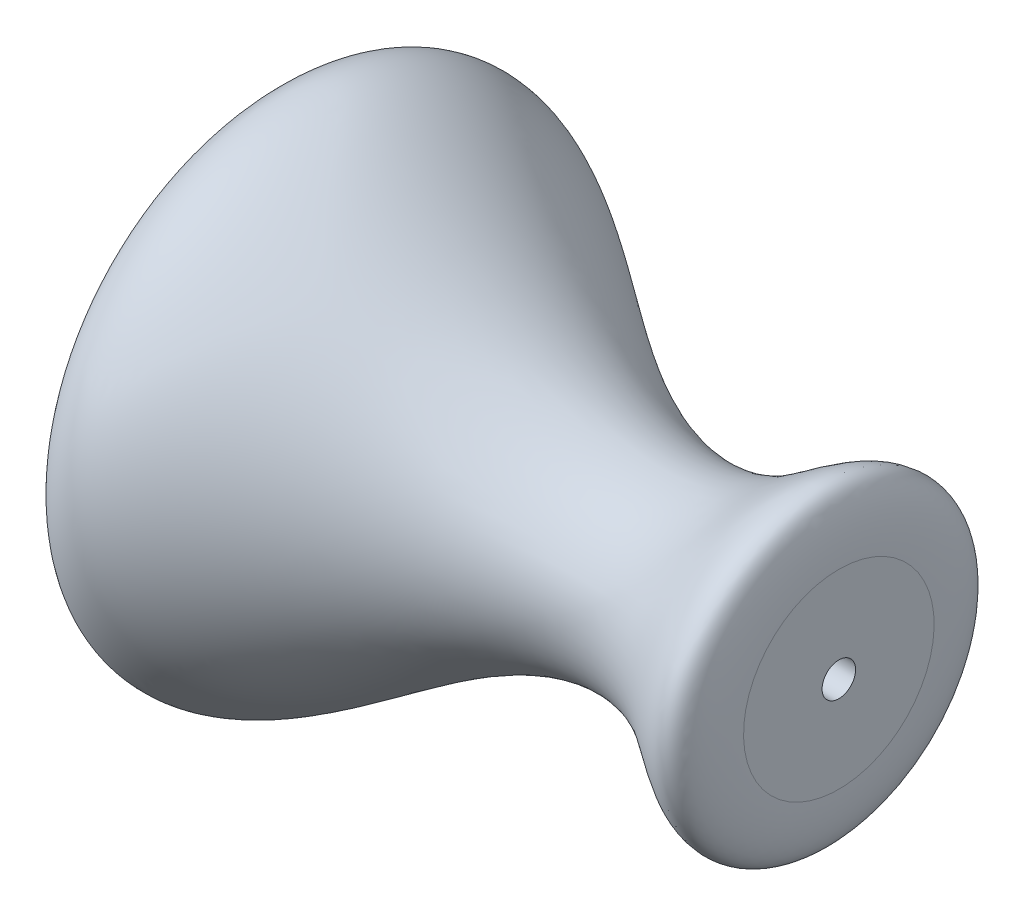
ISO-10303-21;
HEADER;
FILE_DESCRIPTION(('STEP AP214'),'2;1');
FILE_NAME('part.step','',(''),(''),'','','');
FILE_SCHEMA(('AUTOMOTIVE_DESIGN { 1 0 10303 214 1 1 1 1 }'));
ENDSEC;
DATA;
#1=APPLICATION_CONTEXT('core data for automotive mechanical design processes');
#2=APPLICATION_PROTOCOL_DEFINITION('international standard','automotive_design',2000,#1);
#3=PRODUCT_CONTEXT('',#1,'mechanical');
#4=PRODUCT('Part','Part','',(#3));
#5=PRODUCT_RELATED_PRODUCT_CATEGORY('part','',(#4));
#6=PRODUCT_DEFINITION_FORMATION('','',#4);
#7=PRODUCT_DEFINITION_CONTEXT('part definition',#1,'design');
#8=PRODUCT_DEFINITION('design','',#6,#7);
#9=PRODUCT_DEFINITION_SHAPE('','',#8);
#10=(LENGTH_UNIT() NAMED_UNIT(*) SI_UNIT(.MILLI.,.METRE.));
#11=(NAMED_UNIT(*) PLANE_ANGLE_UNIT() SI_UNIT($,.RADIAN.));
#12=(NAMED_UNIT(*) SI_UNIT($,.STERADIAN.) SOLID_ANGLE_UNIT());
#13=UNCERTAINTY_MEASURE_WITH_UNIT(LENGTH_MEASURE(1.E-05),#10,'distance_accuracy_value','');
#14=(GEOMETRIC_REPRESENTATION_CONTEXT(3) GLOBAL_UNCERTAINTY_ASSIGNED_CONTEXT((#13)) GLOBAL_UNIT_ASSIGNED_CONTEXT((#10,
#11,#12)) REPRESENTATION_CONTEXT('',''));
#15=CARTESIAN_POINT('',(0.,0.,0.));
#16=DIRECTION('',(0.,0.,1.));
#17=DIRECTION('',(1.,0.,0.));
#18=AXIS2_PLACEMENT_3D('',#15,#16,#17);
#19=CARTESIAN_POINT('',(115.724163653393,17.8177217986729,0.));
#20=CARTESIAN_POINT('',(115.60730411532,37.6825490152691,0.));
#21=CARTESIAN_POINT('',(95.7049364217856,12.9336687561518,0.));
#22=CARTESIAN_POINT('',(40.4394496640898,24.5476742082101,0.));
#23=CARTESIAN_POINT('',(6.48231181844581,79.3587573406456,0.));
#24=CARTESIAN_POINT('',(0.,0.,0.));
#25=B_SPLINE_CURVE_WITH_KNOTS('',3,(#19,#20,#21,#22,#23,#24),.UNSPECIFIED.,.F.,.F.,(4,1,1,4),
(0.,0.176811646806817,0.391048483911922,1.),.UNSPECIFIED.);
#26=CARTESIAN_POINT('',(53.8626351613709,0.,0.));
#27=DIRECTION('',(1.,0.,0.));
#28=AXIS1_PLACEMENT('',#26,#27);
#29=SURFACE_OF_REVOLUTION('',#25,#28);
#30=CARTESIAN_POINT('',(0.,0.,0.));
#31=VERTEX_POINT('',#30);
#32=VERTEX_LOOP('',#31);
#33=FACE_BOUND('',#32,.T.);
#34=CARTESIAN_POINT('',(115.724163653393,0.,0.));
#35=DIRECTION('',(1.,0.,0.));
#36=DIRECTION('',(0.,1.,0.));
#37=AXIS2_PLACEMENT_3D('',#34,#35,#36);
#38=CIRCLE('',#37,17.8177217986729);
#39=CARTESIAN_POINT('',(115.724163653393,17.8177217986729,0.));
#40=VERTEX_POINT('',#39);
#41=EDGE_CURVE('E52',#40,#40,#38,.T.);
#42=ORIENTED_EDGE('',*,*,#41,.F.);
#43=EDGE_LOOP('',(#42));
#44=FACE_BOUND('',#43,.T.);
#45=ADVANCED_FACE('F33',(#33,#44),#29,.F.);
#46=CARTESIAN_POINT('',(53.8626351613709,0.,0.));
#47=DIRECTION('',(1.,0.,0.));
#48=DIRECTION('',(0.,1.,0.));
#49=AXIS2_PLACEMENT_3D('',#46,#47,#48);
#50=CONICAL_SURFACE('',#49,0.,0.78539816339745);
#51=CARTESIAN_POINT('',(56.9990880622609,0.,0.));
#52=DIRECTION('',(1.,0.,0.));
#53=DIRECTION('',(0.,1.,0.));
#54=AXIS2_PLACEMENT_3D('',#51,#52,#53);
#55=CIRCLE('',#54,3.13645290088999);
#56=CARTESIAN_POINT('',(56.9990880622609,3.13645290088999,0.));
#57=VERTEX_POINT('',#56);
#58=EDGE_CURVE('E11',#57,#57,#55,.T.);
#59=ORIENTED_EDGE('',*,*,#58,.T.);
#60=EDGE_LOOP('',(#59));
#61=FACE_BOUND('',#60,.T.);
#62=CARTESIAN_POINT('',(53.8626351613709,0.,0.));
#63=VERTEX_POINT('',#62);
#64=VERTEX_LOOP('',#63);
#65=FACE_BOUND('',#64,.T.);
#66=ADVANCED_FACE('F49',(#61,#65),#50,.F.);
#67=CARTESIAN_POINT('',(53.8626351613709,0.,0.));
#68=DIRECTION('',(1.,0.,0.));
#69=DIRECTION('',(0.,1.,0.));
#70=AXIS2_PLACEMENT_3D('',#67,#68,#69);
#71=CYLINDRICAL_SURFACE('',#70,3.13645290088999);
#72=CARTESIAN_POINT('',(115.724163653393,0.,0.));
#73=DIRECTION('',(1.,0.,0.));
#74=DIRECTION('',(0.,1.,0.));
#75=AXIS2_PLACEMENT_3D('',#72,#73,#74);
#76=CIRCLE('',#75,3.13645290088999);
#77=CARTESIAN_POINT('',(115.724163653393,3.13645290088999,0.));
#78=VERTEX_POINT('',#77);
#79=EDGE_CURVE('E41',#78,#78,#76,.T.);
#80=ORIENTED_EDGE('',*,*,#79,.T.);
#81=EDGE_LOOP('',(#80));
#82=FACE_BOUND('',#81,.T.);
#83=ORIENTED_EDGE('',*,*,#58,.F.);
#84=EDGE_LOOP('',(#83));
#85=FACE_BOUND('',#84,.T.);
#86=ADVANCED_FACE('F64',(#82,#85),#71,.F.);
#87=CARTESIAN_POINT('',(115.724163653393,17.8177217986729,0.));
#88=DIRECTION('',(1.,0.,0.));
#89=DIRECTION('',(0.,1.,0.));
#90=AXIS2_PLACEMENT_3D('',#87,#88,#89);
#91=PLANE('',#90);
#92=ORIENTED_EDGE('',*,*,#41,.T.);
#93=EDGE_LOOP('',(#92));
#94=FACE_BOUND('',#93,.T.);
#95=ORIENTED_EDGE('',*,*,#79,.F.);
#96=EDGE_LOOP('',(#95));
#97=FACE_BOUND('',#96,.T.);
#98=ADVANCED_FACE('F67',(#94,#97),#91,.T.);
#99=CLOSED_SHELL('',(#45,#66,#86,#98));
#100=MANIFOLD_SOLID_BREP('B2',#99);
#101=ADVANCED_BREP_SHAPE_REPRESENTATION('',(#18,#100),#14);
#102=SHAPE_DEFINITION_REPRESENTATION(#9,#101);
ENDSEC;
END-ISO-10303-21;
